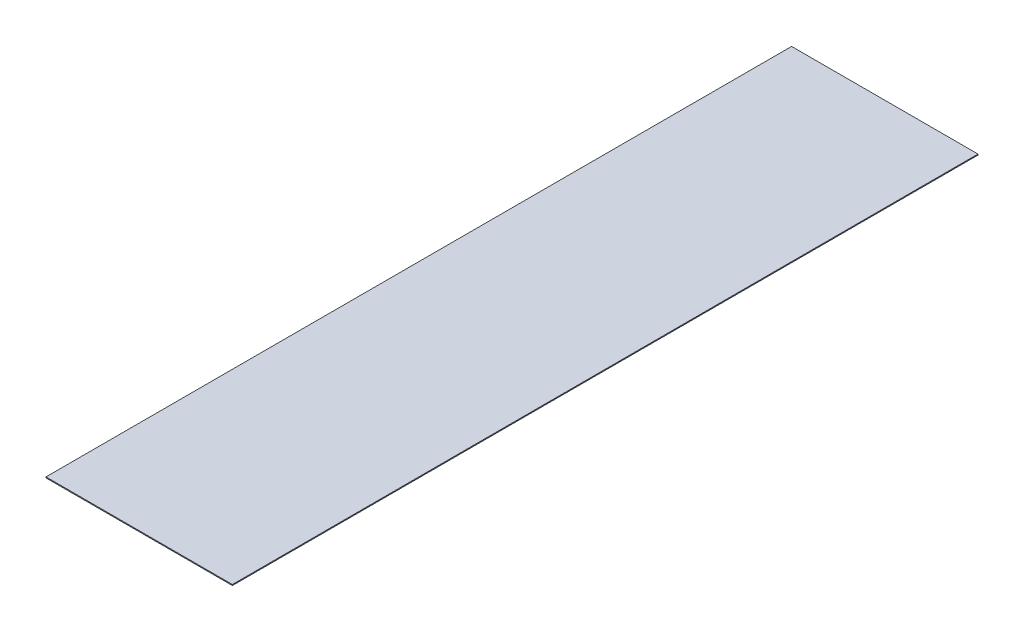
ISO-10303-21;
HEADER;
FILE_DESCRIPTION(('STEP AP214'),'2;1');
FILE_NAME('part.step','',(''),(''),'','','');
FILE_SCHEMA(('AUTOMOTIVE_DESIGN { 1 0 10303 214 1 1 1 1 }'));
ENDSEC;
DATA;
#1=APPLICATION_CONTEXT('core data for automotive mechanical design processes');
#2=APPLICATION_PROTOCOL_DEFINITION('international standard','automotive_design',2000,#1);
#3=PRODUCT_CONTEXT('',#1,'mechanical');
#4=PRODUCT('Part','Part','',(#3));
#5=PRODUCT_RELATED_PRODUCT_CATEGORY('part','',(#4));
#6=PRODUCT_DEFINITION_FORMATION('','',#4);
#7=PRODUCT_DEFINITION_CONTEXT('part definition',#1,'design');
#8=PRODUCT_DEFINITION('design','',#6,#7);
#9=PRODUCT_DEFINITION_SHAPE('','',#8);
#10=(LENGTH_UNIT() NAMED_UNIT(*) SI_UNIT(.MILLI.,.METRE.));
#11=(NAMED_UNIT(*) PLANE_ANGLE_UNIT() SI_UNIT($,.RADIAN.));
#12=(NAMED_UNIT(*) SI_UNIT($,.STERADIAN.) SOLID_ANGLE_UNIT());
#13=UNCERTAINTY_MEASURE_WITH_UNIT(LENGTH_MEASURE(1.E-05),#10,'distance_accuracy_value','');
#14=(GEOMETRIC_REPRESENTATION_CONTEXT(3) GLOBAL_UNCERTAINTY_ASSIGNED_CONTEXT((#13)) GLOBAL_UNIT_ASSIGNED_CONTEXT((#10,
#11,#12)) REPRESENTATION_CONTEXT('',''));
#15=CARTESIAN_POINT('',(0.,0.,0.));
#16=DIRECTION('',(0.,0.,1.));
#17=DIRECTION('',(1.,0.,0.));
#18=AXIS2_PLACEMENT_3D('',#15,#16,#17);
#19=CARTESIAN_POINT('',(2.37318429211096,2.601,1.3894262452162E-13));
#20=DIRECTION('',(1.,0.,0.));
#21=DIRECTION('',(0.,0.,-1.));
#22=AXIS2_PLACEMENT_3D('',#19,#20,#21);
#23=PLANE('',#22);
#24=DIRECTION('',(0.,0.,1.));
#25=VECTOR('',#24,1.);
#26=CARTESIAN_POINT('',(2.37318429211096,2.6,1.3894262452162E-13));
#27=LINE('',#26,#25);
#28=CARTESIAN_POINT('',(2.37318429211081,2.6,1.91907068929162));
#29=VERTEX_POINT('',#28);
#30=CARTESIAN_POINT('',(2.3731842921108,2.6,2.71907068929162));
#31=VERTEX_POINT('',#30);
#32=EDGE_CURVE('E11',#29,#31,#27,.T.);
#33=ORIENTED_EDGE('',*,*,#32,.F.);
#34=DIRECTION('',(0.,-1.,0.));
#35=VECTOR('',#34,1.);
#36=CARTESIAN_POINT('',(2.37318429211081,2.601,1.91907068929162));
#37=LINE('',#36,#35);
#38=CARTESIAN_POINT('',(2.37318429211081,2.601,1.91907068929162));
#39=VERTEX_POINT('',#38);
#40=EDGE_CURVE('E24',#39,#29,#37,.T.);
#41=ORIENTED_EDGE('',*,*,#40,.F.);
#42=DIRECTION('',(0.,0.,1.));
#43=VECTOR('',#42,1.);
#44=CARTESIAN_POINT('',(2.37318429211096,2.601,1.3894262452162E-13));
#45=LINE('',#44,#43);
#46=CARTESIAN_POINT('',(2.3731842921108,2.601,2.71907068929162));
#47=VERTEX_POINT('',#46);
#48=EDGE_CURVE('E88',#39,#47,#45,.T.);
#49=ORIENTED_EDGE('',*,*,#48,.T.);
#50=DIRECTION('',(0.,-1.,0.));
#51=VECTOR('',#50,1.);
#52=CARTESIAN_POINT('',(2.3731842921108,2.601,2.71907068929162));
#53=LINE('',#52,#51);
#54=EDGE_CURVE('E77',#47,#31,#53,.T.);
#55=ORIENTED_EDGE('',*,*,#54,.T.);
#56=EDGE_LOOP('',(#33,#41,#49,#55));
#57=FACE_BOUND('',#56,.T.);
#58=ADVANCED_FACE('F17',(#57),#23,.T.);
#59=CARTESIAN_POINT('',(0.,2.601,1.91907068929162));
#60=DIRECTION('',(0.,0.,-1.));
#61=DIRECTION('',(-1.,0.,0.));
#62=AXIS2_PLACEMENT_3D('',#59,#60,#61);
#63=PLANE('',#62);
#64=DIRECTION('',(1.,0.,0.));
#65=VECTOR('',#64,1.);
#66=CARTESIAN_POINT('',(0.,2.6,1.91907068929162));
#67=LINE('',#66,#65);
#68=CARTESIAN_POINT('',(2.17318429211115,2.6,1.91907068929162));
#69=VERTEX_POINT('',#68);
#70=EDGE_CURVE('E85',#69,#29,#67,.T.);
#71=ORIENTED_EDGE('',*,*,#70,.F.);
#72=DIRECTION('',(0.,-1.,0.));
#73=VECTOR('',#72,1.);
#74=CARTESIAN_POINT('',(2.17318429211115,2.601,1.91907068929162));
#75=LINE('',#74,#73);
#76=CARTESIAN_POINT('',(2.17318429211115,2.601,1.91907068929162));
#77=VERTEX_POINT('',#76);
#78=EDGE_CURVE('E83',#77,#69,#75,.T.);
#79=ORIENTED_EDGE('',*,*,#78,.F.);
#80=DIRECTION('',(1.,0.,0.));
#81=VECTOR('',#80,1.);
#82=CARTESIAN_POINT('',(0.,2.601,1.91907068929162));
#83=LINE('',#82,#81);
#84=EDGE_CURVE('E72',#77,#39,#83,.T.);
#85=ORIENTED_EDGE('',*,*,#84,.T.);
#86=ORIENTED_EDGE('',*,*,#40,.T.);
#87=EDGE_LOOP('',(#71,#79,#85,#86));
#88=FACE_BOUND('',#87,.T.);
#89=ADVANCED_FACE('F90',(#88),#63,.T.);
#90=CARTESIAN_POINT('',(2.17318429211115,2.601,0.));
#91=DIRECTION('',(1.,0.,0.));
#92=DIRECTION('',(0.,0.,-1.));
#93=AXIS2_PLACEMENT_3D('',#90,#91,#92);
#94=PLANE('',#93);
#95=DIRECTION('',(0.,0.,1.));
#96=VECTOR('',#95,1.);
#97=CARTESIAN_POINT('',(2.17318429211115,2.6,0.));
#98=LINE('',#97,#96);
#99=CARTESIAN_POINT('',(2.17318429211115,2.6,2.71907068929162));
#100=VERTEX_POINT('',#99);
#101=EDGE_CURVE('E60',#69,#100,#98,.T.);
#102=ORIENTED_EDGE('',*,*,#101,.T.);
#103=DIRECTION('',(0.,-1.,0.));
#104=VECTOR('',#103,1.);
#105=CARTESIAN_POINT('',(2.17318429211115,2.601,2.71907068929162));
#106=LINE('',#105,#104);
#107=CARTESIAN_POINT('',(2.17318429211115,2.601,2.71907068929162));
#108=VERTEX_POINT('',#107);
#109=EDGE_CURVE('E54',#108,#100,#106,.T.);
#110=ORIENTED_EDGE('',*,*,#109,.F.);
#111=DIRECTION('',(0.,0.,1.));
#112=VECTOR('',#111,1.);
#113=CARTESIAN_POINT('',(2.17318429211115,2.601,0.));
#114=LINE('',#113,#112);
#115=EDGE_CURVE('E58',#77,#108,#114,.T.);
#116=ORIENTED_EDGE('',*,*,#115,.F.);
#117=ORIENTED_EDGE('',*,*,#78,.T.);
#118=EDGE_LOOP('',(#102,#110,#116,#117));
#119=FACE_BOUND('',#118,.T.);
#120=ADVANCED_FACE('F56',(#119),#94,.F.);
#121=CARTESIAN_POINT('',(0.,2.601,2.71907068929162));
#122=DIRECTION('',(0.,0.,-1.));
#123=DIRECTION('',(-1.,0.,0.));
#124=AXIS2_PLACEMENT_3D('',#121,#122,#123);
#125=PLANE('',#124);
#126=DIRECTION('',(1.,0.,0.));
#127=VECTOR('',#126,1.);
#128=CARTESIAN_POINT('',(0.,2.6,2.71907068929162));
#129=LINE('',#128,#127);
#130=EDGE_CURVE('E73',#100,#31,#129,.T.);
#131=ORIENTED_EDGE('',*,*,#130,.T.);
#132=ORIENTED_EDGE('',*,*,#54,.F.);
#133=DIRECTION('',(1.,0.,0.));
#134=VECTOR('',#133,1.);
#135=CARTESIAN_POINT('',(0.,2.601,2.71907068929162));
#136=LINE('',#135,#134);
#137=EDGE_CURVE('E70',#108,#47,#136,.T.);
#138=ORIENTED_EDGE('',*,*,#137,.F.);
#139=ORIENTED_EDGE('',*,*,#109,.T.);
#140=EDGE_LOOP('',(#131,#132,#138,#139));
#141=FACE_BOUND('',#140,.T.);
#142=ADVANCED_FACE('F76',(#141),#125,.F.);
#143=CARTESIAN_POINT('',(0.,2.601,0.));
#144=DIRECTION('',(0.,1.,0.));
#145=DIRECTION('',(0.,0.,1.));
#146=AXIS2_PLACEMENT_3D('',#143,#144,#145);
#147=PLANE('',#146);
#148=ORIENTED_EDGE('',*,*,#48,.F.);
#149=ORIENTED_EDGE('',*,*,#84,.F.);
#150=ORIENTED_EDGE('',*,*,#115,.T.);
#151=ORIENTED_EDGE('',*,*,#137,.T.);
#152=EDGE_LOOP('',(#148,#149,#150,#151));
#153=FACE_BOUND('',#152,.T.);
#154=ADVANCED_FACE('F69',(#153),#147,.T.);
#155=CARTESIAN_POINT('',(0.,2.6,0.));
#156=DIRECTION('',(0.,1.,0.));
#157=DIRECTION('',(0.,0.,1.));
#158=AXIS2_PLACEMENT_3D('',#155,#156,#157);
#159=PLANE('',#158);
#160=ORIENTED_EDGE('',*,*,#32,.T.);
#161=ORIENTED_EDGE('',*,*,#130,.F.);
#162=ORIENTED_EDGE('',*,*,#101,.F.);
#163=ORIENTED_EDGE('',*,*,#70,.T.);
#164=EDGE_LOOP('',(#160,#161,#162,#163));
#165=FACE_BOUND('',#164,.T.);
#166=ADVANCED_FACE('F91',(#165),#159,.F.);
#167=CLOSED_SHELL('',(#58,#89,#120,#142,#154,#166));
#168=MANIFOLD_SOLID_BREP('B1',#167);
#169=ADVANCED_BREP_SHAPE_REPRESENTATION('',(#18,#168),#14);
#170=SHAPE_DEFINITION_REPRESENTATION(#9,#169);
ENDSEC;
END-ISO-10303-21;
